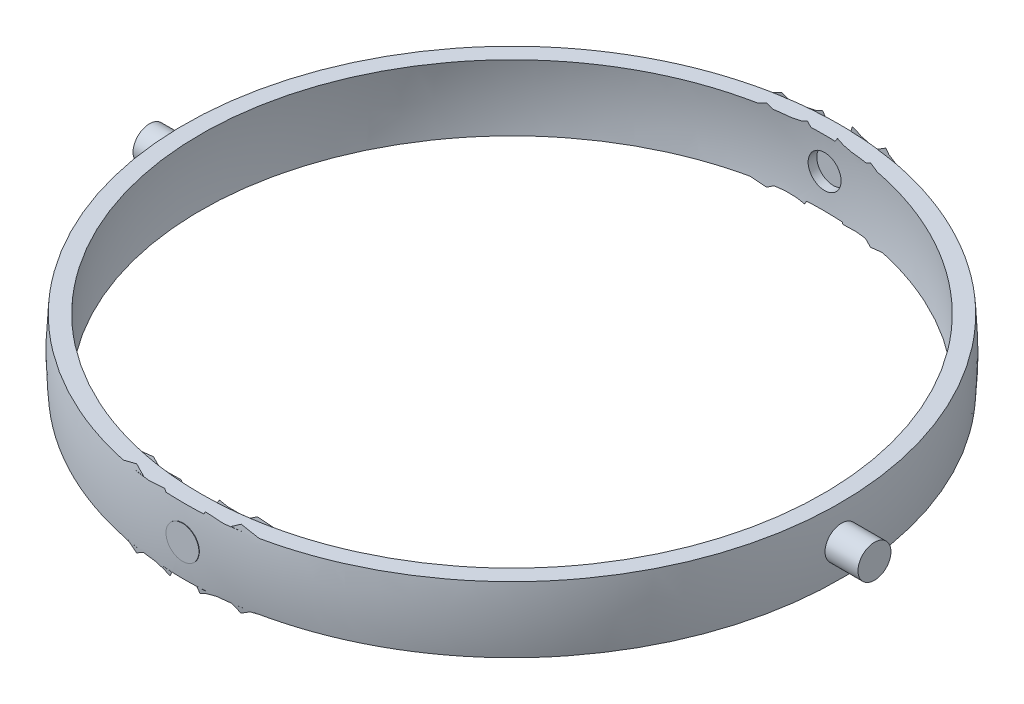
ISO-10303-21;
HEADER;
FILE_DESCRIPTION(('STEP AP214'),'2;1');
FILE_NAME('part.step','',(''),(''),'','','');
FILE_SCHEMA(('AUTOMOTIVE_DESIGN { 1 0 10303 214 1 1 1 1 }'));
ENDSEC;
DATA;
#1=APPLICATION_CONTEXT('core data for automotive mechanical design processes');
#2=APPLICATION_PROTOCOL_DEFINITION('international standard','automotive_design',2000,#1);
#3=PRODUCT_CONTEXT('',#1,'mechanical');
#4=PRODUCT('Part','Part','',(#3));
#5=PRODUCT_RELATED_PRODUCT_CATEGORY('part','',(#4));
#6=PRODUCT_DEFINITION_FORMATION('','',#4);
#7=PRODUCT_DEFINITION_CONTEXT('part definition',#1,'design');
#8=PRODUCT_DEFINITION('design','',#6,#7);
#9=PRODUCT_DEFINITION_SHAPE('','',#8);
#10=(LENGTH_UNIT() NAMED_UNIT(*) SI_UNIT(.MILLI.,.METRE.));
#11=(NAMED_UNIT(*) PLANE_ANGLE_UNIT() SI_UNIT($,.RADIAN.));
#12=(NAMED_UNIT(*) SI_UNIT($,.STERADIAN.) SOLID_ANGLE_UNIT());
#13=UNCERTAINTY_MEASURE_WITH_UNIT(LENGTH_MEASURE(1.E-05),#10,'distance_accuracy_value','');
#14=(GEOMETRIC_REPRESENTATION_CONTEXT(3) GLOBAL_UNCERTAINTY_ASSIGNED_CONTEXT((#13)) GLOBAL_UNIT_ASSIGNED_CONTEXT((#10,
#11,#12)) REPRESENTATION_CONTEXT('',''));
#15=CARTESIAN_POINT('',(0.,0.,0.));
#16=DIRECTION('',(0.,0.,1.));
#17=DIRECTION('',(1.,0.,0.));
#18=AXIS2_PLACEMENT_3D('',#15,#16,#17);
#19=CARTESIAN_POINT('',(-44.,0.,0.));
#20=DIRECTION('',(1.,0.,0.));
#21=DIRECTION('',(0.,1.,0.));
#22=AXIS2_PLACEMENT_3D('',#19,#20,#21);
#23=PLANE('',#22);
#24=CARTESIAN_POINT('',(-44.,0.,0.));
#25=DIRECTION('',(-1.,0.,0.));
#26=DIRECTION('',(0.,1.,0.));
#27=AXIS2_PLACEMENT_3D('',#24,#25,#26);
#28=CIRCLE('',#27,2.);
#29=CARTESIAN_POINT('',(-44.,-2.,0.));
#30=VERTEX_POINT('',#29);
#31=EDGE_CURVE('P0_E10',#30,#30,#28,.T.);
#32=ORIENTED_EDGE('',*,*,#31,.T.);
#33=EDGE_LOOP('',(#32));
#34=FACE_BOUND('',#33,.T.);
#35=ADVANCED_FACE('P0_F16',(#34),#23,.F.);
#36=CARTESIAN_POINT('',(-40.,0.,0.));
#37=DIRECTION('',(1.,0.,0.));
#38=DIRECTION('',(0.,1.,0.));
#39=AXIS2_PLACEMENT_3D('',#36,#37,#38);
#40=CYLINDRICAL_SURFACE('',#39,2.);
#41=ORIENTED_EDGE('',*,*,#31,.F.);
#42=DIRECTION('',(1.,0.,0.));
#43=VECTOR('',#42,1.);
#44=CARTESIAN_POINT('',(-40.,-2.,0.));
#45=LINE('',#44,#43);
#46=CARTESIAN_POINT('',(-40.,-2.,0.));
#47=VERTEX_POINT('',#46);
#48=EDGE_CURVE('P0_E25',#30,#47,#45,.T.);
#49=ORIENTED_EDGE('',*,*,#48,.T.);
#50=CARTESIAN_POINT('',(-40.,0.,0.));
#51=DIRECTION('',(1.,0.,0.));
#52=DIRECTION('',(0.,1.,0.));
#53=AXIS2_PLACEMENT_3D('',#50,#51,#52);
#54=CIRCLE('',#53,2.);
#55=EDGE_CURVE('P0_E40',#47,#47,#54,.T.);
#56=ORIENTED_EDGE('',*,*,#55,.F.);
#57=ORIENTED_EDGE('',*,*,#48,.F.);
#58=EDGE_LOOP('',(#41,#49,#56,#57));
#59=FACE_BOUND('',#58,.T.);
#60=ADVANCED_FACE('P0_F41',(#59),#40,.T.);
#61=CARTESIAN_POINT('',(-40.,0.,0.));
#62=DIRECTION('',(1.,0.,0.));
#63=DIRECTION('',(0.,1.,0.));
#64=AXIS2_PLACEMENT_3D('',#61,#62,#63);
#65=PLANE('',#64);
#66=ORIENTED_EDGE('',*,*,#55,.T.);
#67=EDGE_LOOP('',(#66));
#68=FACE_BOUND('',#67,.T.);
#69=ADVANCED_FACE('P0_F18',(#68),#65,.T.);
#70=CLOSED_SHELL('',(#35,#60,#69));
#71=MANIFOLD_SOLID_BREP('P0_B1',#70);
#72=CARTESIAN_POINT('',(44.,0.,0.));
#73=DIRECTION('',(1.,0.,0.));
#74=DIRECTION('',(0.,1.,0.));
#75=AXIS2_PLACEMENT_3D('',#72,#73,#74);
#76=PLANE('',#75);
#77=CARTESIAN_POINT('',(44.,0.,0.));
#78=DIRECTION('',(1.,0.,0.));
#79=DIRECTION('',(0.,1.,0.));
#80=AXIS2_PLACEMENT_3D('',#77,#78,#79);
#81=CIRCLE('',#80,2.);
#82=CARTESIAN_POINT('',(44.,-2.,0.));
#83=VERTEX_POINT('',#82);
#84=EDGE_CURVE('P1_E11',#83,#83,#81,.T.);
#85=ORIENTED_EDGE('',*,*,#84,.T.);
#86=EDGE_LOOP('',(#85));
#87=FACE_BOUND('',#86,.T.);
#88=ADVANCED_FACE('P1_F17',(#87),#76,.T.);
#89=CARTESIAN_POINT('',(40.,0.,0.));
#90=DIRECTION('',(1.,0.,0.));
#91=DIRECTION('',(0.,1.,0.));
#92=AXIS2_PLACEMENT_3D('',#89,#90,#91);
#93=CYLINDRICAL_SURFACE('',#92,2.);
#94=ORIENTED_EDGE('',*,*,#84,.F.);
#95=DIRECTION('',(-1.,0.,0.));
#96=VECTOR('',#95,1.);
#97=CARTESIAN_POINT('',(40.,-2.,0.));
#98=LINE('',#97,#96);
#99=CARTESIAN_POINT('',(40.,-2.,0.));
#100=VERTEX_POINT('',#99);
#101=EDGE_CURVE('P1_E21',#83,#100,#98,.T.);
#102=ORIENTED_EDGE('',*,*,#101,.T.);
#103=CARTESIAN_POINT('',(40.,0.,0.));
#104=DIRECTION('',(1.,0.,0.));
#105=DIRECTION('',(0.,1.,0.));
#106=AXIS2_PLACEMENT_3D('',#103,#104,#105);
#107=CIRCLE('',#106,2.);
#108=EDGE_CURVE('P1_E43',#100,#100,#107,.T.);
#109=ORIENTED_EDGE('',*,*,#108,.T.);
#110=ORIENTED_EDGE('',*,*,#101,.F.);
#111=EDGE_LOOP('',(#94,#102,#109,#110));
#112=FACE_BOUND('',#111,.T.);
#113=ADVANCED_FACE('P1_F19',(#112),#93,.T.);
#114=CARTESIAN_POINT('',(40.,0.,0.));
#115=DIRECTION('',(1.,0.,0.));
#116=DIRECTION('',(0.,1.,0.));
#117=AXIS2_PLACEMENT_3D('',#114,#115,#116);
#118=PLANE('',#117);
#119=ORIENTED_EDGE('',*,*,#108,.F.);
#120=EDGE_LOOP('',(#119));
#121=FACE_BOUND('',#120,.T.);
#122=ADVANCED_FACE('P1_F44',(#121),#118,.F.);
#123=CLOSED_SHELL('',(#88,#113,#122));
#124=MANIFOLD_SOLID_BREP('P1_B1',#123);
#125=CARTESIAN_POINT('',(0.,0.,0.));
#126=DIRECTION('',(0.,0.,1.));
#127=DIRECTION('',(1.,0.,0.));
#128=AXIS2_PLACEMENT_3D('',#125,#126,#127);
#129=SPHERICAL_SURFACE('',#128,40.);
#130=CARTESIAN_POINT('',(0.,0.,39.9499687108764));
#131=DIRECTION('',(0.,0.,-1.));
#132=DIRECTION('',(1.,0.,0.));
#133=AXIS2_PLACEMENT_3D('',#130,#131,#132);
#134=CIRCLE('',#133,2.);
#135=CARTESIAN_POINT('',(-2.,0.,39.9499687108764));
#136=VERTEX_POINT('',#135);
#137=EDGE_CURVE('P2_E10',#136,#136,#134,.T.);
#138=ORIENTED_EDGE('',*,*,#137,.T.);
#139=CARTESIAN_POINT('',(0.,0.,0.));
#140=DIRECTION('',(0.,-1.,0.));
#141=DIRECTION('',(-1.,0.,0.));
#142=AXIS2_PLACEMENT_3D('',#139,#140,#141);
#143=CIRCLE('',#142,40.);
#144=CARTESIAN_POINT('',(-40.,0.,0.));
#145=VERTEX_POINT('',#144);
#146=EDGE_CURVE('P2_E27',#136,#145,#143,.T.);
#147=ORIENTED_EDGE('',*,*,#146,.T.);
#148=CARTESIAN_POINT('',(0.,0.,0.));
#149=DIRECTION('',(0.,-1.,0.));
#150=DIRECTION('',(-1.,0.,0.));
#151=AXIS2_PLACEMENT_3D('',#148,#149,#150);
#152=CIRCLE('',#151,40.);
#153=CARTESIAN_POINT('',(-2.,0.,-39.9499687108764));
#154=VERTEX_POINT('',#153);
#155=EDGE_CURVE('P2_E86',#145,#154,#152,.T.);
#156=ORIENTED_EDGE('',*,*,#155,.T.);
#157=CARTESIAN_POINT('',(0.,0.,-39.9499687108764));
#158=DIRECTION('',(0.,0.,1.));
#159=DIRECTION('',(1.,0.,0.));
#160=AXIS2_PLACEMENT_3D('',#157,#158,#159);
#161=CIRCLE('',#160,2.);
#162=EDGE_CURVE('P2_E78',#154,#154,#161,.T.);
#163=ORIENTED_EDGE('',*,*,#162,.T.);
#164=ORIENTED_EDGE('',*,*,#155,.F.);
#165=ORIENTED_EDGE('',*,*,#146,.F.);
#166=EDGE_LOOP('',(#138,#147,#156,#163,#164,#165));
#167=FACE_BOUND('',#166,.T.);
#168=CARTESIAN_POINT('',(0.,-4.,0.));
#169=DIRECTION('',(0.,1.,0.));
#170=DIRECTION('',(0.,0.,-1.));
#171=AXIS2_PLACEMENT_3D('',#168,#169,#170);
#172=CIRCLE('',#171,39.7994974842648);
#173=CARTESIAN_POINT('',(0.,-4.,39.7994974842648));
#174=VERTEX_POINT('',#173);
#175=EDGE_CURVE('P2_E73',#174,#174,#172,.T.);
#176=ORIENTED_EDGE('',*,*,#175,.T.);
#177=EDGE_LOOP('',(#176));
#178=FACE_BOUND('',#177,.T.);
#179=CARTESIAN_POINT('',(0.,4.,0.));
#180=DIRECTION('',(0.,-1.,0.));
#181=DIRECTION('',(0.,0.,1.));
#182=AXIS2_PLACEMENT_3D('',#179,#180,#181);
#183=CIRCLE('',#182,39.7994974842648);
#184=CARTESIAN_POINT('',(0.,4.,-39.7994974842648));
#185=VERTEX_POINT('',#184);
#186=EDGE_CURVE('P2_E67',#185,#185,#183,.T.);
#187=ORIENTED_EDGE('',*,*,#186,.T.);
#188=EDGE_LOOP('',(#187));
#189=FACE_BOUND('',#188,.T.);
#190=ADVANCED_FACE('P2_F16',(#167,#178,#189),#129,.T.);
#191=CARTESIAN_POINT('',(-65.,4.,0.));
#192=DIRECTION('',(0.,-1.,0.));
#193=DIRECTION('',(0.,0.,-1.));
#194=AXIS2_PLACEMENT_3D('',#191,#192,#193);
#195=PLANE('',#194);
#196=ORIENTED_EDGE('',*,*,#186,.F.);
#197=EDGE_LOOP('',(#196));
#198=FACE_BOUND('',#197,.T.);
#199=CARTESIAN_POINT('',(0.,4.,0.));
#200=DIRECTION('',(0.,-1.,0.));
#201=DIRECTION('',(0.,0.,1.));
#202=AXIS2_PLACEMENT_3D('',#199,#200,#201);
#203=CIRCLE('',#202,37.7888872553824);
#204=CARTESIAN_POINT('',(0.,4.,-37.7888872553824));
#205=VERTEX_POINT('',#204);
#206=EDGE_CURVE('P2_E61',#205,#205,#203,.T.);
#207=ORIENTED_EDGE('',*,*,#206,.T.);
#208=EDGE_LOOP('',(#207));
#209=FACE_BOUND('',#208,.T.);
#210=ADVANCED_FACE('P2_F195',(#198,#209),#195,.F.);
#211=CARTESIAN_POINT('',(65.,-4.,0.));
#212=DIRECTION('',(0.,1.,0.));
#213=DIRECTION('',(1.,0.,0.));
#214=AXIS2_PLACEMENT_3D('',#211,#212,#213);
#215=PLANE('',#214);
#216=ORIENTED_EDGE('',*,*,#175,.F.);
#217=EDGE_LOOP('',(#216));
#218=FACE_BOUND('',#217,.T.);
#219=CARTESIAN_POINT('',(0.,-4.,0.));
#220=DIRECTION('',(0.,1.,0.));
#221=DIRECTION('',(0.,0.,-1.));
#222=AXIS2_PLACEMENT_3D('',#219,#220,#221);
#223=CIRCLE('',#222,37.7888872553824);
#224=CARTESIAN_POINT('',(0.,-4.,37.7888872553824));
#225=VERTEX_POINT('',#224);
#226=EDGE_CURVE('P2_E110',#225,#225,#223,.T.);
#227=ORIENTED_EDGE('',*,*,#226,.T.);
#228=EDGE_LOOP('',(#227));
#229=FACE_BOUND('',#228,.T.);
#230=ADVANCED_FACE('P2_F74',(#218,#229),#215,.F.);
#231=CARTESIAN_POINT('',(0.,0.,0.));
#232=DIRECTION('',(0.,0.,1.));
#233=DIRECTION('',(1.,0.,0.));
#234=AXIS2_PLACEMENT_3D('',#231,#232,#233);
#235=SPHERICAL_SURFACE('',#234,38.);
#236=CARTESIAN_POINT('',(0.,0.,-37.9473319220206));
#237=DIRECTION('',(0.,0.,-1.));
#238=DIRECTION('',(1.,0.,0.));
#239=AXIS2_PLACEMENT_3D('',#236,#237,#238);
#240=CIRCLE('',#239,2.);
#241=CARTESIAN_POINT('',(-2.,0.,-37.9473319220206));
#242=VERTEX_POINT('',#241);
#243=EDGE_CURVE('P2_E97',#242,#242,#240,.T.);
#244=ORIENTED_EDGE('',*,*,#243,.T.);
#245=CARTESIAN_POINT('',(0.,0.,0.));
#246=DIRECTION('',(0.,1.,0.));
#247=DIRECTION('',(-1.,0.,0.));
#248=AXIS2_PLACEMENT_3D('',#245,#246,#247);
#249=CIRCLE('',#248,38.);
#250=CARTESIAN_POINT('',(-2.,0.,37.9473319220206));
#251=VERTEX_POINT('',#250);
#252=EDGE_CURVE('P2_E93',#242,#251,#249,.T.);
#253=ORIENTED_EDGE('',*,*,#252,.T.);
#254=CARTESIAN_POINT('',(0.,0.,37.9473319220206));
#255=DIRECTION('',(0.,0.,1.));
#256=DIRECTION('',(1.,0.,0.));
#257=AXIS2_PLACEMENT_3D('',#254,#255,#256);
#258=CIRCLE('',#257,2.);
#259=EDGE_CURVE('P2_E98',#251,#251,#258,.T.);
#260=ORIENTED_EDGE('',*,*,#259,.T.);
#261=ORIENTED_EDGE('',*,*,#252,.F.);
#262=EDGE_LOOP('',(#244,#253,#260,#261));
#263=FACE_BOUND('',#262,.T.);
#264=ORIENTED_EDGE('',*,*,#226,.F.);
#265=EDGE_LOOP('',(#264));
#266=FACE_BOUND('',#265,.T.);
#267=ORIENTED_EDGE('',*,*,#206,.F.);
#268=EDGE_LOOP('',(#267));
#269=FACE_BOUND('',#268,.T.);
#270=ADVANCED_FACE('P2_F149',(#263,#266,#269),#235,.F.);
#271=CARTESIAN_POINT('',(0.,0.,0.));
#272=DIRECTION('',(0.,0.,1.));
#273=DIRECTION('',(1.,0.,0.));
#274=AXIS2_PLACEMENT_3D('',#271,#272,#273);
#275=CYLINDRICAL_SURFACE('',#274,2.);
#276=ORIENTED_EDGE('',*,*,#259,.F.);
#277=DIRECTION('',(0.,0.,1.));
#278=VECTOR('',#277,1.);
#279=CARTESIAN_POINT('',(-2.,0.,0.));
#280=LINE('',#279,#278);
#281=CARTESIAN_POINT('',(-2.,0.,39.));
#282=VERTEX_POINT('',#281);
#283=EDGE_CURVE('P2_E91',#251,#282,#280,.T.);
#284=ORIENTED_EDGE('',*,*,#283,.T.);
#285=CARTESIAN_POINT('',(0.,0.,39.));
#286=DIRECTION('',(0.,0.,1.));
#287=DIRECTION('',(1.,0.,0.));
#288=AXIS2_PLACEMENT_3D('',#285,#286,#287);
#289=CIRCLE('',#288,2.);
#290=EDGE_CURVE('P2_E20',#282,#282,#289,.T.);
#291=ORIENTED_EDGE('',*,*,#290,.T.);
#292=ORIENTED_EDGE('',*,*,#283,.F.);
#293=EDGE_LOOP('',(#276,#284,#291,#292));
#294=FACE_BOUND('',#293,.T.);
#295=ADVANCED_FACE('P2_F201',(#294),#275,.F.);
#296=CARTESIAN_POINT('',(0.,0.,0.));
#297=DIRECTION('',(0.,0.,1.));
#298=DIRECTION('',(1.,0.,0.));
#299=AXIS2_PLACEMENT_3D('',#296,#297,#298);
#300=CYLINDRICAL_SURFACE('',#299,2.);
#301=CARTESIAN_POINT('',(0.,0.,-39.));
#302=DIRECTION('',(0.,0.,-1.));
#303=DIRECTION('',(1.,0.,0.));
#304=AXIS2_PLACEMENT_3D('',#301,#302,#303);
#305=CIRCLE('',#304,2.);
#306=CARTESIAN_POINT('',(-2.,0.,-39.));
#307=VERTEX_POINT('',#306);
#308=EDGE_CURVE('P2_E133',#307,#307,#305,.T.);
#309=ORIENTED_EDGE('',*,*,#308,.T.);
#310=DIRECTION('',(0.,0.,1.));
#311=VECTOR('',#310,1.);
#312=CARTESIAN_POINT('',(-2.,0.,0.));
#313=LINE('',#312,#311);
#314=EDGE_CURVE('P2_E125',#307,#242,#313,.T.);
#315=ORIENTED_EDGE('',*,*,#314,.T.);
#316=ORIENTED_EDGE('',*,*,#243,.F.);
#317=ORIENTED_EDGE('',*,*,#314,.F.);
#318=EDGE_LOOP('',(#309,#315,#316,#317));
#319=FACE_BOUND('',#318,.T.);
#320=ADVANCED_FACE('P2_F155',(#319),#300,.F.);
#321=CARTESIAN_POINT('',(0.,0.,-40.));
#322=DIRECTION('',(0.,0.,1.));
#323=DIRECTION('',(1.,0.,0.));
#324=AXIS2_PLACEMENT_3D('',#321,#322,#323);
#325=PLANE('',#324);
#326=CARTESIAN_POINT('',(0.,0.,-40.));
#327=DIRECTION('',(0.,0.,1.));
#328=DIRECTION('',(1.,0.,0.));
#329=AXIS2_PLACEMENT_3D('',#326,#327,#328);
#330=CIRCLE('',#329,2.);
#331=CARTESIAN_POINT('',(-2.,0.,-40.));
#332=VERTEX_POINT('',#331);
#333=EDGE_CURVE('P2_E117',#332,#332,#330,.T.);
#334=ORIENTED_EDGE('',*,*,#333,.F.);
#335=EDGE_LOOP('',(#334));
#336=FACE_BOUND('',#335,.T.);
#337=ADVANCED_FACE('P2_F213',(#336),#325,.F.);
#338=CARTESIAN_POINT('',(0.,0.,-39.));
#339=DIRECTION('',(0.,0.,1.));
#340=DIRECTION('',(1.,0.,0.));
#341=AXIS2_PLACEMENT_3D('',#338,#339,#340);
#342=PLANE('',#341);
#343=ORIENTED_EDGE('',*,*,#308,.F.);
#344=EDGE_LOOP('',(#343));
#345=FACE_BOUND('',#344,.T.);
#346=ADVANCED_FACE('P2_F18',(#345),#342,.T.);
#347=CARTESIAN_POINT('',(0.,0.,-40.));
#348=DIRECTION('',(0.,0.,1.));
#349=DIRECTION('',(1.,0.,0.));
#350=AXIS2_PLACEMENT_3D('',#347,#348,#349);
#351=CYLINDRICAL_SURFACE('',#350,2.);
#352=ORIENTED_EDGE('',*,*,#162,.F.);
#353=DIRECTION('',(0.,0.,-1.));
#354=VECTOR('',#353,1.);
#355=CARTESIAN_POINT('',(-2.,0.,-40.));
#356=LINE('',#355,#354);
#357=EDGE_CURVE('P2_E121',#154,#332,#356,.T.);
#358=ORIENTED_EDGE('',*,*,#357,.T.);
#359=ORIENTED_EDGE('',*,*,#333,.T.);
#360=ORIENTED_EDGE('',*,*,#357,.F.);
#361=EDGE_LOOP('',(#352,#358,#359,#360));
#362=FACE_BOUND('',#361,.T.);
#363=ADVANCED_FACE('P2_F189',(#362),#351,.T.);
#364=CARTESIAN_POINT('',(0.,0.,39.));
#365=DIRECTION('',(0.,0.,1.));
#366=DIRECTION('',(1.,0.,0.));
#367=AXIS2_PLACEMENT_3D('',#364,#365,#366);
#368=PLANE('',#367);
#369=ORIENTED_EDGE('',*,*,#290,.F.);
#370=EDGE_LOOP('',(#369));
#371=FACE_BOUND('',#370,.T.);
#372=ADVANCED_FACE('P2_F181',(#371),#368,.F.);
#373=CARTESIAN_POINT('',(0.,0.,40.));
#374=DIRECTION('',(0.,0.,1.));
#375=DIRECTION('',(1.,0.,0.));
#376=AXIS2_PLACEMENT_3D('',#373,#374,#375);
#377=PLANE('',#376);
#378=CARTESIAN_POINT('',(0.,0.,40.));
#379=DIRECTION('',(0.,0.,1.));
#380=DIRECTION('',(1.,0.,0.));
#381=AXIS2_PLACEMENT_3D('',#378,#379,#380);
#382=CIRCLE('',#381,2.);
#383=CARTESIAN_POINT('',(-2.,0.,40.));
#384=VERTEX_POINT('',#383);
#385=EDGE_CURVE('P2_E103',#384,#384,#382,.T.);
#386=ORIENTED_EDGE('',*,*,#385,.T.);
#387=EDGE_LOOP('',(#386));
#388=FACE_BOUND('',#387,.T.);
#389=ADVANCED_FACE('P2_F179',(#388),#377,.T.);
#390=CARTESIAN_POINT('',(0.,0.,40.));
#391=DIRECTION('',(0.,0.,-1.));
#392=DIRECTION('',(1.,0.,0.));
#393=AXIS2_PLACEMENT_3D('',#390,#391,#392);
#394=CYLINDRICAL_SURFACE('',#393,2.);
#395=ORIENTED_EDGE('',*,*,#137,.F.);
#396=DIRECTION('',(0.,0.,1.));
#397=VECTOR('',#396,1.);
#398=CARTESIAN_POINT('',(-2.,0.,40.));
#399=LINE('',#398,#397);
#400=EDGE_CURVE('P2_E99',#136,#384,#399,.T.);
#401=ORIENTED_EDGE('',*,*,#400,.T.);
#402=ORIENTED_EDGE('',*,*,#385,.F.);
#403=ORIENTED_EDGE('',*,*,#400,.F.);
#404=EDGE_LOOP('',(#395,#401,#402,#403));
#405=FACE_BOUND('',#404,.T.);
#406=ADVANCED_FACE('P2_F177',(#405),#394,.T.);
#407=CLOSED_SHELL('',(#190,#210,#230,#270,#295,#320,#337,#346,#363,#372,#389,#406));
#408=MANIFOLD_SOLID_BREP('P2_B1',#407);
#409=ADVANCED_BREP_SHAPE_REPRESENTATION('',(#18,#71,#124,#408),#14);
#410=SHAPE_DEFINITION_REPRESENTATION(#9,#409);
ENDSEC;
END-ISO-10303-21;
